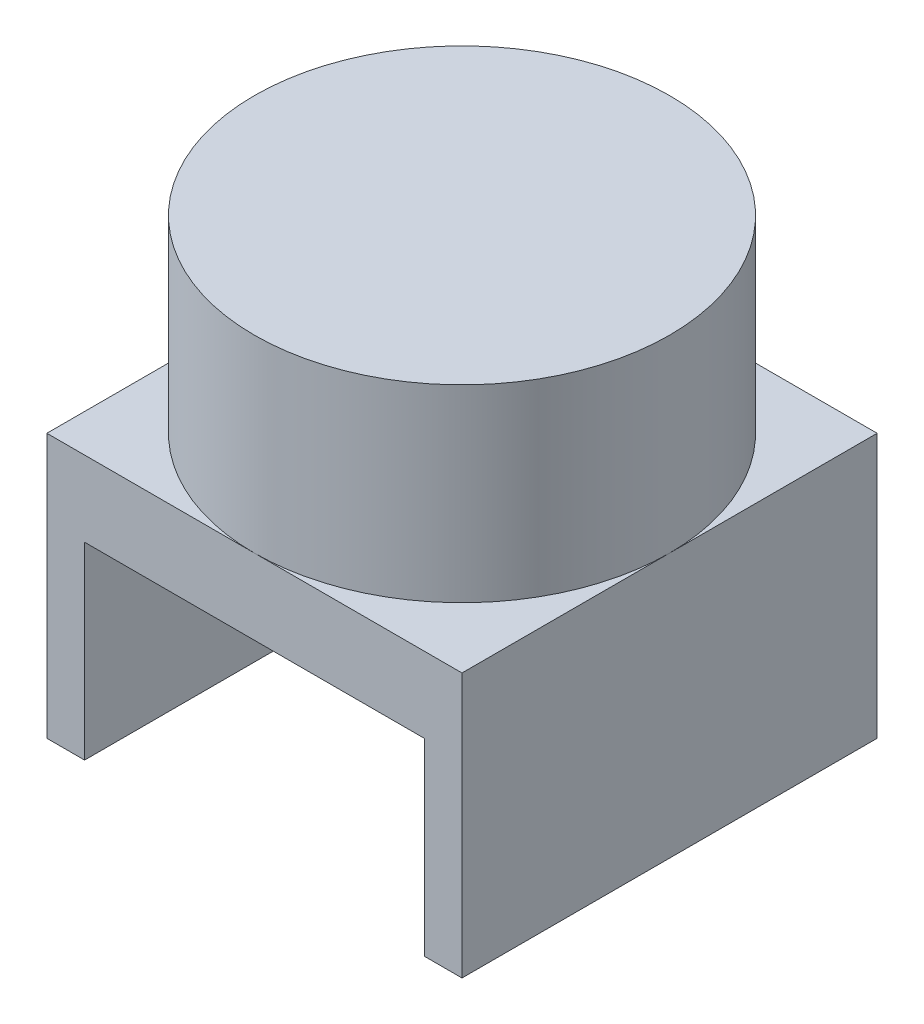
ISO-10303-21;
HEADER;
FILE_DESCRIPTION(('STEP AP214'),'2;1');
FILE_NAME('part.step','',(''),(''),'','','');
FILE_SCHEMA(('AUTOMOTIVE_DESIGN { 1 0 10303 214 1 1 1 1 }'));
ENDSEC;
DATA;
#1=APPLICATION_CONTEXT('core data for automotive mechanical design processes');
#2=APPLICATION_PROTOCOL_DEFINITION('international standard','automotive_design',2000,#1);
#3=PRODUCT_CONTEXT('',#1,'mechanical');
#4=PRODUCT('Part','Part','',(#3));
#5=PRODUCT_RELATED_PRODUCT_CATEGORY('part','',(#4));
#6=PRODUCT_DEFINITION_FORMATION('','',#4);
#7=PRODUCT_DEFINITION_CONTEXT('part definition',#1,'design');
#8=PRODUCT_DEFINITION('design','',#6,#7);
#9=PRODUCT_DEFINITION_SHAPE('','',#8);
#10=(LENGTH_UNIT() NAMED_UNIT(*) SI_UNIT(.MILLI.,.METRE.));
#11=(NAMED_UNIT(*) PLANE_ANGLE_UNIT() SI_UNIT($,.RADIAN.));
#12=(NAMED_UNIT(*) SI_UNIT($,.STERADIAN.) SOLID_ANGLE_UNIT());
#13=UNCERTAINTY_MEASURE_WITH_UNIT(LENGTH_MEASURE(1.E-05),#10,'distance_accuracy_value','');
#14=(GEOMETRIC_REPRESENTATION_CONTEXT(3) GLOBAL_UNCERTAINTY_ASSIGNED_CONTEXT((#13)) GLOBAL_UNIT_ASSIGNED_CONTEXT((#10,
#11,#12)) REPRESENTATION_CONTEXT('',''));
#15=CARTESIAN_POINT('',(0.,0.,0.));
#16=DIRECTION('',(0.,0.,1.));
#17=DIRECTION('',(1.,0.,0.));
#18=AXIS2_PLACEMENT_3D('',#15,#16,#17);
#19=CARTESIAN_POINT('',(0.,-2.,0.));
#20=DIRECTION('',(0.,-1.,0.));
#21=DIRECTION('',(0.,0.,-1.));
#22=AXIS2_PLACEMENT_3D('',#19,#20,#21);
#23=PLANE('',#22);
#24=DIRECTION('',(1.,0.,0.));
#25=VECTOR('',#24,1.);
#26=CARTESIAN_POINT('',(-5.5,-2.,-5.5));
#27=LINE('',#26,#25);
#28=CARTESIAN_POINT('',(-4.5,-2.,-5.5));
#29=VERTEX_POINT('',#28);
#30=CARTESIAN_POINT('',(4.5,-2.,-5.5));
#31=VERTEX_POINT('',#30);
#32=EDGE_CURVE('E59',#29,#31,#27,.T.);
#33=ORIENTED_EDGE('',*,*,#32,.T.);
#34=DIRECTION('',(0.,0.,-1.));
#35=VECTOR('',#34,1.);
#36=CARTESIAN_POINT('',(4.5,-2.,5.5));
#37=LINE('',#36,#35);
#38=CARTESIAN_POINT('',(4.5,-2.,5.5));
#39=VERTEX_POINT('',#38);
#40=EDGE_CURVE('E54',#39,#31,#37,.T.);
#41=ORIENTED_EDGE('',*,*,#40,.F.);
#42=DIRECTION('',(-1.,0.,0.));
#43=VECTOR('',#42,1.);
#44=CARTESIAN_POINT('',(5.5,-2.,5.5));
#45=LINE('',#44,#43);
#46=CARTESIAN_POINT('',(-4.5,-2.,5.5));
#47=VERTEX_POINT('',#46);
#48=EDGE_CURVE('E167',#39,#47,#45,.T.);
#49=ORIENTED_EDGE('',*,*,#48,.T.);
#50=DIRECTION('',(0.,0.,1.));
#51=VECTOR('',#50,1.);
#52=CARTESIAN_POINT('',(-4.5,-2.,5.5));
#53=LINE('',#52,#51);
#54=EDGE_CURVE('E143',#29,#47,#53,.T.);
#55=ORIENTED_EDGE('',*,*,#54,.F.);
#56=EDGE_LOOP('',(#33,#41,#49,#55));
#57=FACE_BOUND('',#56,.T.);
#58=ADVANCED_FACE('F39',(#57),#23,.T.);
#59=CARTESIAN_POINT('',(0.,5.,0.));
#60=DIRECTION('',(0.,-1.,0.));
#61=DIRECTION('',(0.,0.,-1.));
#62=AXIS2_PLACEMENT_3D('',#59,#60,#61);
#63=CYLINDRICAL_SURFACE('',#62,5.5);
#64=CARTESIAN_POINT('',(0.,5.,0.));
#65=DIRECTION('',(0.,1.,0.));
#66=DIRECTION('',(0.,0.,1.));
#67=AXIS2_PLACEMENT_3D('',#64,#65,#66);
#68=CIRCLE('',#67,5.5);
#69=CARTESIAN_POINT('',(0.,5.,5.5));
#70=VERTEX_POINT('',#69);
#71=EDGE_CURVE('E11',#70,#70,#68,.T.);
#72=ORIENTED_EDGE('',*,*,#71,.F.);
#73=EDGE_LOOP('',(#72));
#74=FACE_BOUND('',#73,.T.);
#75=CARTESIAN_POINT('',(0.,0.,0.));
#76=DIRECTION('',(0.,1.,0.));
#77=DIRECTION('',(0.,0.,1.));
#78=AXIS2_PLACEMENT_3D('',#75,#76,#77);
#79=CIRCLE('',#78,5.5);
#80=CARTESIAN_POINT('',(0.,0.,5.5));
#81=VERTEX_POINT('',#80);
#82=CARTESIAN_POINT('',(5.5,0.,0.));
#83=VERTEX_POINT('',#82);
#84=EDGE_CURVE('E43',#81,#83,#79,.T.);
#85=ORIENTED_EDGE('',*,*,#84,.T.);
#86=CARTESIAN_POINT('',(0.,0.,-5.5));
#87=VERTEX_POINT('',#86);
#88=EDGE_CURVE('E193',#83,#87,#79,.T.);
#89=ORIENTED_EDGE('',*,*,#88,.T.);
#90=CARTESIAN_POINT('',(-5.5,0.,0.));
#91=VERTEX_POINT('',#90);
#92=EDGE_CURVE('E189',#87,#91,#79,.T.);
#93=ORIENTED_EDGE('',*,*,#92,.T.);
#94=EDGE_CURVE('E186',#91,#81,#79,.T.);
#95=ORIENTED_EDGE('',*,*,#94,.T.);
#96=EDGE_LOOP('',(#85,#89,#93,#95));
#97=FACE_BOUND('',#96,.T.);
#98=ADVANCED_FACE('F41',(#74,#97),#63,.T.);
#99=CARTESIAN_POINT('',(0.,5.,0.));
#100=DIRECTION('',(0.,1.,0.));
#101=DIRECTION('',(0.,0.,1.));
#102=AXIS2_PLACEMENT_3D('',#99,#100,#101);
#103=PLANE('',#102);
#104=ORIENTED_EDGE('',*,*,#71,.T.);
#105=EDGE_LOOP('',(#104));
#106=FACE_BOUND('',#105,.T.);
#107=ADVANCED_FACE('F244',(#106),#103,.T.);
#108=CARTESIAN_POINT('',(0.,0.,0.));
#109=DIRECTION('',(0.,-1.,0.));
#110=DIRECTION('',(0.,0.,-1.));
#111=AXIS2_PLACEMENT_3D('',#108,#109,#110);
#112=PLANE('',#111);
#113=ORIENTED_EDGE('',*,*,#84,.F.);
#114=DIRECTION('',(-1.,0.,0.));
#115=VECTOR('',#114,1.);
#116=CARTESIAN_POINT('',(5.5,0.,5.5));
#117=LINE('',#116,#115);
#118=CARTESIAN_POINT('',(5.5,0.,5.5));
#119=VERTEX_POINT('',#118);
#120=EDGE_CURVE('E174',#119,#81,#117,.T.);
#121=ORIENTED_EDGE('',*,*,#120,.F.);
#122=DIRECTION('',(0.,0.,1.));
#123=VECTOR('',#122,1.);
#124=CARTESIAN_POINT('',(5.5,0.,-5.5));
#125=LINE('',#124,#123);
#126=EDGE_CURVE('E166',#83,#119,#125,.T.);
#127=ORIENTED_EDGE('',*,*,#126,.F.);
#128=EDGE_LOOP('',(#113,#121,#127));
#129=FACE_BOUND('',#128,.T.);
#130=ADVANCED_FACE('F201',(#129),#112,.F.);
#131=ORIENTED_EDGE('',*,*,#88,.F.);
#132=CARTESIAN_POINT('',(5.5,0.,-5.5));
#133=VERTEX_POINT('',#132);
#134=EDGE_CURVE('E171',#133,#83,#125,.T.);
#135=ORIENTED_EDGE('',*,*,#134,.F.);
#136=DIRECTION('',(1.,0.,0.));
#137=VECTOR('',#136,1.);
#138=CARTESIAN_POINT('',(-5.5,0.,-5.5));
#139=LINE('',#138,#137);
#140=EDGE_CURVE('E121',#87,#133,#139,.T.);
#141=ORIENTED_EDGE('',*,*,#140,.F.);
#142=EDGE_LOOP('',(#131,#135,#141));
#143=FACE_BOUND('',#142,.T.);
#144=ADVANCED_FACE('F198',(#143),#112,.F.);
#145=ORIENTED_EDGE('',*,*,#92,.F.);
#146=CARTESIAN_POINT('',(-5.5,0.,-5.5));
#147=VERTEX_POINT('',#146);
#148=EDGE_CURVE('E169',#147,#87,#139,.T.);
#149=ORIENTED_EDGE('',*,*,#148,.F.);
#150=DIRECTION('',(0.,0.,-1.));
#151=VECTOR('',#150,1.);
#152=CARTESIAN_POINT('',(-5.5,0.,5.5));
#153=LINE('',#152,#151);
#154=EDGE_CURVE('E176',#91,#147,#153,.T.);
#155=ORIENTED_EDGE('',*,*,#154,.F.);
#156=EDGE_LOOP('',(#145,#149,#155));
#157=FACE_BOUND('',#156,.T.);
#158=ADVANCED_FACE('F229',(#157),#112,.F.);
#159=CARTESIAN_POINT('',(5.5,-2.,-5.5));
#160=DIRECTION('',(-1.,0.,0.));
#161=DIRECTION('',(0.,0.,1.));
#162=AXIS2_PLACEMENT_3D('',#159,#160,#161);
#163=PLANE('',#162);
#164=ORIENTED_EDGE('',*,*,#134,.T.);
#165=ORIENTED_EDGE('',*,*,#126,.T.);
#166=DIRECTION('',(0.,1.,0.));
#167=VECTOR('',#166,1.);
#168=CARTESIAN_POINT('',(5.5,-2.,5.5));
#169=LINE('',#168,#167);
#170=CARTESIAN_POINT('',(5.5,-7.,5.5));
#171=VERTEX_POINT('',#170);
#172=EDGE_CURVE('E139',#171,#119,#169,.T.);
#173=ORIENTED_EDGE('',*,*,#172,.F.);
#174=DIRECTION('',(0.,0.,1.));
#175=VECTOR('',#174,1.);
#176=CARTESIAN_POINT('',(5.5,-7.,-5.5));
#177=LINE('',#176,#175);
#178=CARTESIAN_POINT('',(5.5,-7.,-5.5));
#179=VERTEX_POINT('',#178);
#180=EDGE_CURVE('E131',#179,#171,#177,.T.);
#181=ORIENTED_EDGE('',*,*,#180,.F.);
#182=DIRECTION('',(0.,1.,0.));
#183=VECTOR('',#182,1.);
#184=CARTESIAN_POINT('',(5.5,-2.,-5.5));
#185=LINE('',#184,#183);
#186=EDGE_CURVE('E114',#179,#133,#185,.T.);
#187=ORIENTED_EDGE('',*,*,#186,.T.);
#188=EDGE_LOOP('',(#164,#165,#173,#181,#187));
#189=FACE_BOUND('',#188,.T.);
#190=ADVANCED_FACE('F137',(#189),#163,.F.);
#191=CARTESIAN_POINT('',(5.5,-2.,5.5));
#192=DIRECTION('',(0.,0.,-1.));
#193=DIRECTION('',(-1.,0.,0.));
#194=AXIS2_PLACEMENT_3D('',#191,#192,#193);
#195=PLANE('',#194);
#196=ORIENTED_EDGE('',*,*,#120,.T.);
#197=CARTESIAN_POINT('',(-5.5,0.,5.5));
#198=VERTEX_POINT('',#197);
#199=EDGE_CURVE('E173',#81,#198,#117,.T.);
#200=ORIENTED_EDGE('',*,*,#199,.T.);
#201=DIRECTION('',(0.,1.,0.));
#202=VECTOR('',#201,1.);
#203=CARTESIAN_POINT('',(-5.5,-2.,5.5));
#204=LINE('',#203,#202);
#205=CARTESIAN_POINT('',(-5.5,-7.,5.5));
#206=VERTEX_POINT('',#205);
#207=EDGE_CURVE('E183',#206,#198,#204,.T.);
#208=ORIENTED_EDGE('',*,*,#207,.F.);
#209=DIRECTION('',(-1.,0.,0.));
#210=VECTOR('',#209,1.);
#211=CARTESIAN_POINT('',(-5.5,-7.,5.5));
#212=LINE('',#211,#210);
#213=CARTESIAN_POINT('',(-4.5,-7.,5.5));
#214=VERTEX_POINT('',#213);
#215=EDGE_CURVE('E155',#214,#206,#212,.T.);
#216=ORIENTED_EDGE('',*,*,#215,.F.);
#217=DIRECTION('',(0.,1.,0.));
#218=VECTOR('',#217,1.);
#219=CARTESIAN_POINT('',(-4.5,-7.,5.5));
#220=LINE('',#219,#218);
#221=EDGE_CURVE('E158',#214,#47,#220,.T.);
#222=ORIENTED_EDGE('',*,*,#221,.T.);
#223=ORIENTED_EDGE('',*,*,#48,.F.);
#224=DIRECTION('',(0.,1.,0.));
#225=VECTOR('',#224,1.);
#226=CARTESIAN_POINT('',(4.5,-7.,5.5));
#227=LINE('',#226,#225);
#228=CARTESIAN_POINT('',(4.5,-7.,5.5));
#229=VERTEX_POINT('',#228);
#230=EDGE_CURVE('E222',#229,#39,#227,.T.);
#231=ORIENTED_EDGE('',*,*,#230,.F.);
#232=DIRECTION('',(-1.,0.,0.));
#233=VECTOR('',#232,1.);
#234=CARTESIAN_POINT('',(5.5,-7.,5.5));
#235=LINE('',#234,#233);
#236=EDGE_CURVE('E141',#171,#229,#235,.T.);
#237=ORIENTED_EDGE('',*,*,#236,.F.);
#238=ORIENTED_EDGE('',*,*,#172,.T.);
#239=EDGE_LOOP('',(#196,#200,#208,#216,#222,#223,#231,#237,#238));
#240=FACE_BOUND('',#239,.T.);
#241=ADVANCED_FACE('F203',(#240),#195,.F.);
#242=CARTESIAN_POINT('',(-5.5,-2.,5.5));
#243=DIRECTION('',(1.,0.,0.));
#244=DIRECTION('',(0.,0.,-1.));
#245=AXIS2_PLACEMENT_3D('',#242,#243,#244);
#246=PLANE('',#245);
#247=EDGE_CURVE('E177',#198,#91,#153,.T.);
#248=ORIENTED_EDGE('',*,*,#247,.T.);
#249=ORIENTED_EDGE('',*,*,#154,.T.);
#250=DIRECTION('',(0.,1.,0.));
#251=VECTOR('',#250,1.);
#252=CARTESIAN_POINT('',(-5.5,-2.,-5.5));
#253=LINE('',#252,#251);
#254=CARTESIAN_POINT('',(-5.5,-7.,-5.5));
#255=VERTEX_POINT('',#254);
#256=EDGE_CURVE('E126',#255,#147,#253,.T.);
#257=ORIENTED_EDGE('',*,*,#256,.F.);
#258=DIRECTION('',(0.,0.,-1.));
#259=VECTOR('',#258,1.);
#260=CARTESIAN_POINT('',(-5.5,-7.,-5.5));
#261=LINE('',#260,#259);
#262=EDGE_CURVE('E148',#206,#255,#261,.T.);
#263=ORIENTED_EDGE('',*,*,#262,.F.);
#264=ORIENTED_EDGE('',*,*,#207,.T.);
#265=EDGE_LOOP('',(#248,#249,#257,#263,#264));
#266=FACE_BOUND('',#265,.T.);
#267=ADVANCED_FACE('F209',(#266),#246,.F.);
#268=CARTESIAN_POINT('',(-5.5,-2.,-5.5));
#269=DIRECTION('',(0.,0.,1.));
#270=DIRECTION('',(1.,0.,0.));
#271=AXIS2_PLACEMENT_3D('',#268,#269,#270);
#272=PLANE('',#271);
#273=ORIENTED_EDGE('',*,*,#148,.T.);
#274=ORIENTED_EDGE('',*,*,#140,.T.);
#275=ORIENTED_EDGE('',*,*,#186,.F.);
#276=DIRECTION('',(1.,0.,0.));
#277=VECTOR('',#276,1.);
#278=CARTESIAN_POINT('',(4.5,-7.,-5.5));
#279=LINE('',#278,#277);
#280=CARTESIAN_POINT('',(4.5,-7.,-5.5));
#281=VERTEX_POINT('',#280);
#282=EDGE_CURVE('E119',#281,#179,#279,.T.);
#283=ORIENTED_EDGE('',*,*,#282,.F.);
#284=DIRECTION('',(0.,1.,0.));
#285=VECTOR('',#284,1.);
#286=CARTESIAN_POINT('',(4.5,-7.,-5.5));
#287=LINE('',#286,#285);
#288=EDGE_CURVE('E135',#281,#31,#287,.T.);
#289=ORIENTED_EDGE('',*,*,#288,.T.);
#290=ORIENTED_EDGE('',*,*,#32,.F.);
#291=DIRECTION('',(0.,1.,0.));
#292=VECTOR('',#291,1.);
#293=CARTESIAN_POINT('',(-4.5,-7.,-5.5));
#294=LINE('',#293,#292);
#295=CARTESIAN_POINT('',(-4.5,-7.,-5.5));
#296=VERTEX_POINT('',#295);
#297=EDGE_CURVE('E163',#296,#29,#294,.T.);
#298=ORIENTED_EDGE('',*,*,#297,.F.);
#299=DIRECTION('',(1.,0.,0.));
#300=VECTOR('',#299,1.);
#301=CARTESIAN_POINT('',(-4.5,-7.,-5.5));
#302=LINE('',#301,#300);
#303=EDGE_CURVE('E151',#255,#296,#302,.T.);
#304=ORIENTED_EDGE('',*,*,#303,.F.);
#305=ORIENTED_EDGE('',*,*,#256,.T.);
#306=EDGE_LOOP('',(#273,#274,#275,#283,#289,#290,#298,#304,#305));
#307=FACE_BOUND('',#306,.T.);
#308=ADVANCED_FACE('F117',(#307),#272,.F.);
#309=ORIENTED_EDGE('',*,*,#94,.F.);
#310=ORIENTED_EDGE('',*,*,#247,.F.);
#311=ORIENTED_EDGE('',*,*,#199,.F.);
#312=EDGE_LOOP('',(#309,#310,#311));
#313=FACE_BOUND('',#312,.T.);
#314=ADVANCED_FACE('F206',(#313),#112,.F.);
#315=CARTESIAN_POINT('',(-4.5,-7.,5.5));
#316=DIRECTION('',(-1.,0.,0.));
#317=DIRECTION('',(0.,0.,1.));
#318=AXIS2_PLACEMENT_3D('',#315,#316,#317);
#319=PLANE('',#318);
#320=ORIENTED_EDGE('',*,*,#54,.T.);
#321=ORIENTED_EDGE('',*,*,#221,.F.);
#322=DIRECTION('',(0.,0.,1.));
#323=VECTOR('',#322,1.);
#324=CARTESIAN_POINT('',(-4.5,-7.,5.5));
#325=LINE('',#324,#323);
#326=EDGE_CURVE('E153',#296,#214,#325,.T.);
#327=ORIENTED_EDGE('',*,*,#326,.F.);
#328=ORIENTED_EDGE('',*,*,#297,.T.);
#329=EDGE_LOOP('',(#320,#321,#327,#328));
#330=FACE_BOUND('',#329,.T.);
#331=ADVANCED_FACE('F219',(#330),#319,.F.);
#332=CARTESIAN_POINT('',(0.,-7.,0.));
#333=DIRECTION('',(0.,1.,0.));
#334=DIRECTION('',(0.,0.,1.));
#335=AXIS2_PLACEMENT_3D('',#332,#333,#334);
#336=PLANE('',#335);
#337=ORIENTED_EDGE('',*,*,#262,.T.);
#338=ORIENTED_EDGE('',*,*,#303,.T.);
#339=ORIENTED_EDGE('',*,*,#326,.T.);
#340=ORIENTED_EDGE('',*,*,#215,.T.);
#341=EDGE_LOOP('',(#337,#338,#339,#340));
#342=FACE_BOUND('',#341,.T.);
#343=ADVANCED_FACE('F213',(#342),#336,.F.);
#344=CARTESIAN_POINT('',(4.5,-7.,5.5));
#345=DIRECTION('',(1.,0.,0.));
#346=DIRECTION('',(0.,0.,-1.));
#347=AXIS2_PLACEMENT_3D('',#344,#345,#346);
#348=PLANE('',#347);
#349=ORIENTED_EDGE('',*,*,#40,.T.);
#350=ORIENTED_EDGE('',*,*,#288,.F.);
#351=DIRECTION('',(0.,0.,-1.));
#352=VECTOR('',#351,1.);
#353=CARTESIAN_POINT('',(4.5,-7.,5.5));
#354=LINE('',#353,#352);
#355=EDGE_CURVE('E133',#229,#281,#354,.T.);
#356=ORIENTED_EDGE('',*,*,#355,.F.);
#357=ORIENTED_EDGE('',*,*,#230,.T.);
#358=EDGE_LOOP('',(#349,#350,#356,#357));
#359=FACE_BOUND('',#358,.T.);
#360=ADVANCED_FACE('F224',(#359),#348,.F.);
#361=CARTESIAN_POINT('',(0.,-7.,0.));
#362=DIRECTION('',(0.,-1.,0.));
#363=DIRECTION('',(0.,0.,-1.));
#364=AXIS2_PLACEMENT_3D('',#361,#362,#363);
#365=PLANE('',#364);
#366=ORIENTED_EDGE('',*,*,#180,.T.);
#367=ORIENTED_EDGE('',*,*,#236,.T.);
#368=ORIENTED_EDGE('',*,*,#355,.T.);
#369=ORIENTED_EDGE('',*,*,#282,.T.);
#370=EDGE_LOOP('',(#366,#367,#368,#369));
#371=FACE_BOUND('',#370,.T.);
#372=ADVANCED_FACE('F130',(#371),#365,.T.);
#373=CLOSED_SHELL('',(#58,#98,#107,#130,#144,#158,#190,#241,#267,#308,#314,#331,#343,#360,#372));
#374=MANIFOLD_SOLID_BREP('B2',#373);
#375=ADVANCED_BREP_SHAPE_REPRESENTATION('',(#18,#374),#14);
#376=SHAPE_DEFINITION_REPRESENTATION(#9,#375);
ENDSEC;
END-ISO-10303-21;
